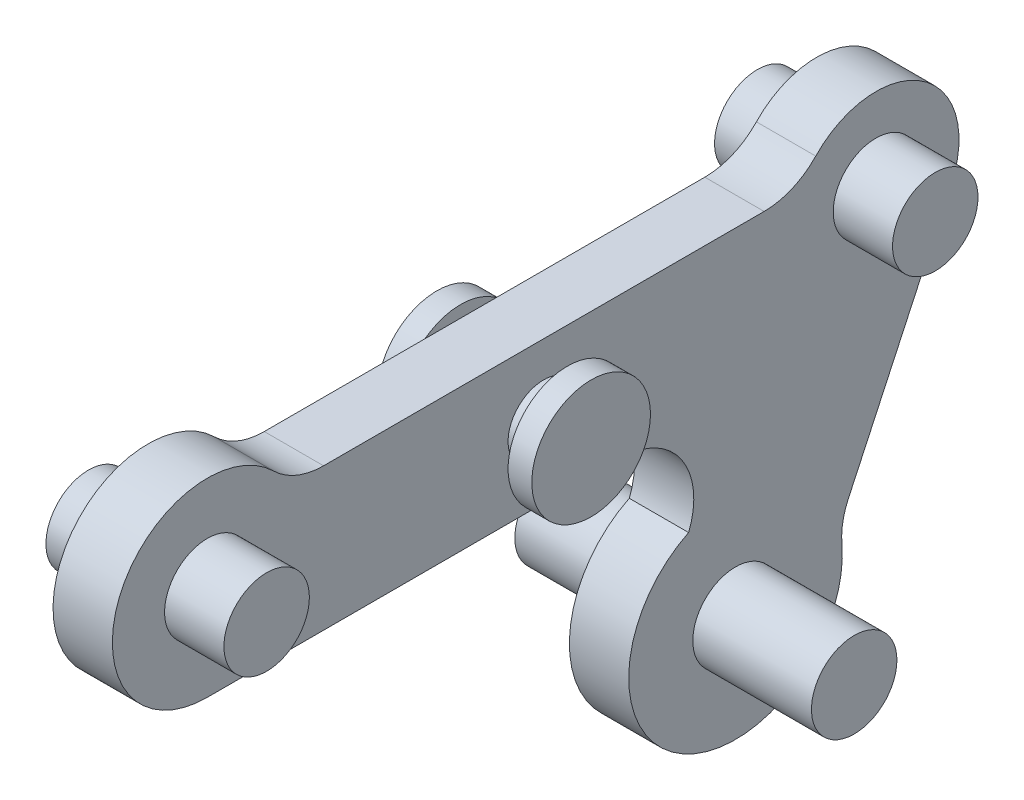
ISO-10303-21;
HEADER;
FILE_DESCRIPTION(('STEP AP214'),'2;1');
FILE_NAME('part.step','',(''),(''),'','','');
FILE_SCHEMA(('AUTOMOTIVE_DESIGN { 1 0 10303 214 1 1 1 1 }'));
ENDSEC;
DATA;
#1=APPLICATION_CONTEXT('core data for automotive mechanical design processes');
#2=APPLICATION_PROTOCOL_DEFINITION('international standard','automotive_design',2000,#1);
#3=PRODUCT_CONTEXT('',#1,'mechanical');
#4=PRODUCT('Part','Part','',(#3));
#5=PRODUCT_RELATED_PRODUCT_CATEGORY('part','',(#4));
#6=PRODUCT_DEFINITION_FORMATION('','',#4);
#7=PRODUCT_DEFINITION_CONTEXT('part definition',#1,'design');
#8=PRODUCT_DEFINITION('design','',#6,#7);
#9=PRODUCT_DEFINITION_SHAPE('','',#8);
#10=(LENGTH_UNIT() NAMED_UNIT(*) SI_UNIT(.MILLI.,.METRE.));
#11=(NAMED_UNIT(*) PLANE_ANGLE_UNIT() SI_UNIT($,.RADIAN.));
#12=(NAMED_UNIT(*) SI_UNIT($,.STERADIAN.) SOLID_ANGLE_UNIT());
#13=UNCERTAINTY_MEASURE_WITH_UNIT(LENGTH_MEASURE(1.E-05),#10,'distance_accuracy_value','');
#14=(GEOMETRIC_REPRESENTATION_CONTEXT(3) GLOBAL_UNCERTAINTY_ASSIGNED_CONTEXT((#13)) GLOBAL_UNIT_ASSIGNED_CONTEXT((#10,
#11,#12)) REPRESENTATION_CONTEXT('',''));
#15=CARTESIAN_POINT('',(0.,0.,0.));
#16=DIRECTION('',(0.,0.,1.));
#17=DIRECTION('',(1.,0.,0.));
#18=AXIS2_PLACEMENT_3D('',#15,#16,#17);
#19=CARTESIAN_POINT('',(1.25,-0.520836083907537,28.1720772546283));
#20=DIRECTION('',(1.,0.,0.));
#21=DIRECTION('',(0.,0.,-1.));
#22=AXIS2_PLACEMENT_3D('',#19,#20,#21);
#23=PLANE('',#22);
#24=CARTESIAN_POINT('',(1.25,-1.52083608390754,14.));
#25=DIRECTION('',(1.,0.,0.));
#26=DIRECTION('',(0.,0.,-1.));
#27=AXIS2_PLACEMENT_3D('',#24,#25,#26);
#28=CIRCLE('',#27,1.5);
#29=CARTESIAN_POINT('',(1.25,-1.52083608390754,12.5));
#30=VERTEX_POINT('',#29);
#31=EDGE_CURVE('E271',#30,#30,#28,.T.);
#32=ORIENTED_EDGE('',*,*,#31,.F.);
#33=EDGE_LOOP('',(#32));
#34=FACE_BOUND('',#33,.T.);
#35=CARTESIAN_POINT('',(1.25,-12.6883090185131,5.91665566436985));
#36=DIRECTION('',(1.,0.,0.));
#37=DIRECTION('',(0.,0.,-1.));
#38=AXIS2_PLACEMENT_3D('',#35,#36,#37);
#39=CIRCLE('',#38,1.8);
#40=CARTESIAN_POINT('',(1.25,-12.6883090185131,4.11665566436985));
#41=VERTEX_POINT('',#40);
#42=EDGE_CURVE('E279',#41,#41,#39,.T.);
#43=ORIENTED_EDGE('',*,*,#42,.F.);
#44=EDGE_LOOP('',(#43));
#45=FACE_BOUND('',#44,.T.);
#46=CARTESIAN_POINT('',(1.25,0.,0.));
#47=DIRECTION('',(1.,0.,0.));
#48=DIRECTION('',(0.,0.,-1.));
#49=AXIS2_PLACEMENT_3D('',#46,#47,#48);
#50=CIRCLE('',#49,1.8);
#51=CARTESIAN_POINT('',(1.25,0.,-1.8));
#52=VERTEX_POINT('',#51);
#53=EDGE_CURVE('E287',#52,#52,#50,.T.);
#54=ORIENTED_EDGE('',*,*,#53,.F.);
#55=EDGE_LOOP('',(#54));
#56=FACE_BOUND('',#55,.T.);
#57=CARTESIAN_POINT('',(1.25,-0.520836083907537,28.1720772546283));
#58=DIRECTION('',(1.,0.,0.));
#59=DIRECTION('',(0.,0.,-1.));
#60=AXIS2_PLACEMENT_3D('',#57,#58,#59);
#61=CIRCLE('',#60,1.8);
#62=CARTESIAN_POINT('',(1.25,-0.520836083907537,26.3720772546283));
#63=VERTEX_POINT('',#62);
#64=EDGE_CURVE('E295',#63,#63,#61,.T.);
#65=ORIENTED_EDGE('',*,*,#64,.F.);
#66=EDGE_LOOP('',(#65));
#67=FACE_BOUND('',#66,.T.);
#68=DIRECTION('',(0.,-0.906307787036648,0.422618261740703));
#69=VECTOR('',#68,1.);
#70=CARTESIAN_POINT('',(1.25,-1.47916391609246,-3.17207725462827));
#71=LINE('',#70,#69);
#72=CARTESIAN_POINT('',(1.25,-1.47916391609246,-3.17207725462827));
#73=VERTEX_POINT('',#72);
#74=CARTESIAN_POINT('',(1.25,-10.7763797085491,1.16328566891389));
#75=VERTEX_POINT('',#74);
#76=EDGE_CURVE('E322',#73,#75,#71,.T.);
#77=ORIENTED_EDGE('',*,*,#76,.F.);
#78=CARTESIAN_POINT('',(1.25,0.,0.));
#79=DIRECTION('',(1.,0.,0.));
#80=DIRECTION('',(0.,0.,-1.));
#81=AXIS2_PLACEMENT_3D('',#78,#79,#80);
#82=CIRCLE('',#81,3.5);
#83=CARTESIAN_POINT('',(1.25,2.41185749328056,2.53632478837124));
#84=VERTEX_POINT('',#83);
#85=EDGE_CURVE('E316',#73,#84,#82,.T.);
#86=ORIENTED_EDGE('',*,*,#85,.T.);
#87=CARTESIAN_POINT('',(1.25,4.47916391609246,4.71031746411802));
#88=DIRECTION('',(1.,0.,0.));
#89=DIRECTION('',(0.,0.,-1.));
#90=AXIS2_PLACEMENT_3D('',#87,#88,#89);
#91=CIRCLE('',#90,3.);
#92=CARTESIAN_POINT('',(1.25,1.47916391609246,4.71031746411802));
#93=VERTEX_POINT('',#92);
#94=EDGE_CURVE('E136',#84,#93,#91,.F.);
#95=ORIENTED_EDGE('',*,*,#94,.T.);
#96=DIRECTION('',(0.,0.,-1.));
#97=VECTOR('',#96,1.);
#98=CARTESIAN_POINT('',(1.25,1.47916391609246,28.1720772546283));
#99=LINE('',#98,#97);
#100=CARTESIAN_POINT('',(1.25,1.47916391609246,23.2730977690619));
#101=VERTEX_POINT('',#100);
#102=EDGE_CURVE('E308',#101,#93,#99,.T.);
#103=ORIENTED_EDGE('',*,*,#102,.F.);
#104=CARTESIAN_POINT('',(1.25,4.47916391609246,23.2730977690619));
#105=DIRECTION('',(1.,0.,0.));
#106=DIRECTION('',(0.,0.,-1.));
#107=AXIS2_PLACEMENT_3D('',#104,#105,#106);
#108=CIRCLE('',#107,3.);
#109=CARTESIAN_POINT('',(1.25,2.33630677323532,25.3726604057332));
#110=VERTEX_POINT('',#109);
#111=EDGE_CURVE('E12',#101,#110,#108,.F.);
#112=ORIENTED_EDGE('',*,*,#111,.T.);
#113=CARTESIAN_POINT('',(1.25,-0.520836083907537,28.1720772546283));
#114=DIRECTION('',(1.,0.,0.));
#115=DIRECTION('',(0.,0.,-1.));
#116=AXIS2_PLACEMENT_3D('',#113,#114,#115);
#117=CIRCLE('',#116,3.99999999999999);
#118=CARTESIAN_POINT('',(1.25,-4.52083608390754,28.1720772546283));
#119=VERTEX_POINT('',#118);
#120=EDGE_CURVE('E217',#110,#119,#117,.T.);
#121=ORIENTED_EDGE('',*,*,#120,.T.);
#122=DIRECTION('',(0.,0.,-1.));
#123=VECTOR('',#122,1.);
#124=CARTESIAN_POINT('',(1.25,-4.52083608390754,28.1720772546283));
#125=LINE('',#124,#123);
#126=CARTESIAN_POINT('',(1.25,-4.52083608390754,10.674509524397));
#127=VERTEX_POINT('',#126);
#128=EDGE_CURVE('E213',#119,#127,#125,.T.);
#129=ORIENTED_EDGE('',*,*,#128,.T.);
#130=CARTESIAN_POINT('',(1.25,-7.52083608390754,10.674509524397));
#131=DIRECTION('',(1.,0.,0.));
#132=DIRECTION('',(0.,0.,-1.));
#133=AXIS2_PLACEMENT_3D('',#130,#131,#132);
#134=CIRCLE('',#133,3.);
#135=CARTESIAN_POINT('',(1.25,-8.64571957419743,7.89338796407762));
#136=VERTEX_POINT('',#135);
#137=EDGE_CURVE('E352',#127,#136,#134,.F.);
#138=ORIENTED_EDGE('',*,*,#137,.T.);
#139=CARTESIAN_POINT('',(1.25,-12.6883090185131,5.91665566436985));
#140=DIRECTION('',(1.,0.,0.));
#141=DIRECTION('',(0.,0.,-1.));
#142=AXIS2_PLACEMENT_3D('',#139,#140,#141);
#143=CIRCLE('',#142,4.50000000000002);
#144=CARTESIAN_POINT('',(1.25,-12.3018643036679,1.4332796504303));
#145=VERTEX_POINT('',#144);
#146=EDGE_CURVE('E303',#136,#145,#143,.T.);
#147=ORIENTED_EDGE('',*,*,#146,.T.);
#148=CARTESIAN_POINT('',(1.25,-12.0442344937712,-1.55563769219605));
#149=DIRECTION('',(1.,0.,0.));
#150=DIRECTION('',(0.,0.,-1.));
#151=AXIS2_PLACEMENT_3D('',#148,#149,#150);
#152=CIRCLE('',#151,3.);
#153=EDGE_CURVE('E349',#145,#75,#152,.F.);
#154=ORIENTED_EDGE('',*,*,#153,.T.);
#155=EDGE_LOOP('',(#77,#86,#95,#103,#112,#121,#129,#138,#147,#154));
#156=FACE_BOUND('',#155,.T.);
#157=ADVANCED_FACE('F127',(#34,#45,#56,#67,#156),#23,.T.);
#158=CARTESIAN_POINT('',(1.25,-0.520836083907537,28.1720772546283));
#159=DIRECTION('',(-1.,0.,0.));
#160=DIRECTION('',(0.,0.,1.));
#161=AXIS2_PLACEMENT_3D('',#158,#159,#160);
#162=CYLINDRICAL_SURFACE('',#161,3.99999999999999);
#163=ORIENTED_EDGE('',*,*,#120,.F.);
#164=DIRECTION('',(-1.,0.,0.));
#165=VECTOR('',#164,1.);
#166=CARTESIAN_POINT('',(1.25,2.33630677323532,25.3726604057332));
#167=LINE('',#166,#165);
#168=CARTESIAN_POINT('',(-1.25,2.33630677323532,25.3726604057332));
#169=VERTEX_POINT('',#168);
#170=EDGE_CURVE('E223',#110,#169,#167,.T.);
#171=ORIENTED_EDGE('',*,*,#170,.T.);
#172=CARTESIAN_POINT('',(-1.25,-0.520836083907537,28.1720772546283));
#173=DIRECTION('',(1.,0.,0.));
#174=DIRECTION('',(0.,0.,-1.));
#175=AXIS2_PLACEMENT_3D('',#172,#173,#174);
#176=CIRCLE('',#175,3.99999999999999);
#177=CARTESIAN_POINT('',(-1.25,-4.52083608390754,28.1720772546283));
#178=VERTEX_POINT('',#177);
#179=EDGE_CURVE('E220',#169,#178,#176,.T.);
#180=ORIENTED_EDGE('',*,*,#179,.T.);
#181=DIRECTION('',(-1.,0.,0.));
#182=VECTOR('',#181,1.);
#183=CARTESIAN_POINT('',(1.25,-4.52083608390753,28.1720772546283));
#184=LINE('',#183,#182);
#185=EDGE_CURVE('E206',#119,#178,#184,.T.);
#186=ORIENTED_EDGE('',*,*,#185,.F.);
#187=EDGE_LOOP('',(#163,#171,#180,#186));
#188=FACE_BOUND('',#187,.T.);
#189=ADVANCED_FACE('F221',(#188),#162,.T.);
#190=CARTESIAN_POINT('',(1.25,-12.6883090185131,5.91665566436985));
#191=DIRECTION('',(-1.,0.,0.));
#192=DIRECTION('',(0.,0.,1.));
#193=AXIS2_PLACEMENT_3D('',#190,#191,#192);
#194=CYLINDRICAL_SURFACE('',#193,4.50000000000002);
#195=DIRECTION('',(-1.,0.,0.));
#196=VECTOR('',#195,1.);
#197=CARTESIAN_POINT('',(1.25,-8.64571957419743,7.89338796407762));
#198=LINE('',#197,#196);
#199=CARTESIAN_POINT('',(-1.25,-8.64571957419743,7.89338796407762));
#200=VERTEX_POINT('',#199);
#201=EDGE_CURVE('E319',#136,#200,#198,.T.);
#202=ORIENTED_EDGE('',*,*,#201,.T.);
#203=CARTESIAN_POINT('',(-1.25,-12.6883090185131,5.91665566436985));
#204=DIRECTION('',(1.,0.,0.));
#205=DIRECTION('',(0.,0.,-1.));
#206=AXIS2_PLACEMENT_3D('',#203,#204,#205);
#207=CIRCLE('',#206,4.50000000000002);
#208=CARTESIAN_POINT('',(-1.25,-12.3018643036679,1.4332796504303));
#209=VERTEX_POINT('',#208);
#210=EDGE_CURVE('E249',#200,#209,#207,.T.);
#211=ORIENTED_EDGE('',*,*,#210,.T.);
#212=DIRECTION('',(-1.,0.,0.));
#213=VECTOR('',#212,1.);
#214=CARTESIAN_POINT('',(1.25,-12.3018643036679,1.4332796504303));
#215=LINE('',#214,#213);
#216=EDGE_CURVE('E333',#209,#145,#215,.F.);
#217=ORIENTED_EDGE('',*,*,#216,.T.);
#218=ORIENTED_EDGE('',*,*,#146,.F.);
#219=EDGE_LOOP('',(#202,#211,#217,#218));
#220=FACE_BOUND('',#219,.T.);
#221=ADVANCED_FACE('F377',(#220),#194,.T.);
#222=CARTESIAN_POINT('',(1.25,-1.47916391609246,-3.17207725462827));
#223=DIRECTION('',(0.,-0.422618261740703,-0.906307787036648));
#224=DIRECTION('',(0.,0.906307787036648,-0.422618261740703));
#225=AXIS2_PLACEMENT_3D('',#222,#223,#224);
#226=PLANE('',#225);
#227=ORIENTED_EDGE('',*,*,#76,.T.);
#228=DIRECTION('',(-1.,0.,0.));
#229=VECTOR('',#228,1.);
#230=CARTESIAN_POINT('',(1.25,-10.7763797085491,1.16328566891389));
#231=LINE('',#230,#229);
#232=CARTESIAN_POINT('',(-1.25,-10.7763797085491,1.16328566891389));
#233=VERTEX_POINT('',#232);
#234=EDGE_CURVE('E216',#75,#233,#231,.T.);
#235=ORIENTED_EDGE('',*,*,#234,.T.);
#236=DIRECTION('',(0.,-0.906307787036648,0.422618261740703));
#237=VECTOR('',#236,1.);
#238=CARTESIAN_POINT('',(-1.25,-1.47916391609246,-3.17207725462827));
#239=LINE('',#238,#237);
#240=CARTESIAN_POINT('',(-1.25,-1.47916391609246,-3.17207725462827));
#241=VERTEX_POINT('',#240);
#242=EDGE_CURVE('E243',#241,#233,#239,.T.);
#243=ORIENTED_EDGE('',*,*,#242,.F.);
#244=DIRECTION('',(-1.,0.,0.));
#245=VECTOR('',#244,1.);
#246=CARTESIAN_POINT('',(1.25,-1.47916391609246,-3.17207725462827));
#247=LINE('',#246,#245);
#248=EDGE_CURVE('E312',#73,#241,#247,.T.);
#249=ORIENTED_EDGE('',*,*,#248,.F.);
#250=EDGE_LOOP('',(#227,#235,#243,#249));
#251=FACE_BOUND('',#250,.T.);
#252=ADVANCED_FACE('F383',(#251),#226,.T.);
#253=CARTESIAN_POINT('',(1.25,0.,0.));
#254=DIRECTION('',(-1.,0.,0.));
#255=DIRECTION('',(0.,0.,1.));
#256=AXIS2_PLACEMENT_3D('',#253,#254,#255);
#257=CYLINDRICAL_SURFACE('',#256,3.5);
#258=ORIENTED_EDGE('',*,*,#248,.T.);
#259=CARTESIAN_POINT('',(-1.25,0.,0.));
#260=DIRECTION('',(1.,0.,0.));
#261=DIRECTION('',(0.,0.,-1.));
#262=AXIS2_PLACEMENT_3D('',#259,#260,#261);
#263=CIRCLE('',#262,3.5);
#264=CARTESIAN_POINT('',(-1.25,2.41185749328056,2.53632478837124));
#265=VERTEX_POINT('',#264);
#266=EDGE_CURVE('E237',#241,#265,#263,.T.);
#267=ORIENTED_EDGE('',*,*,#266,.T.);
#268=DIRECTION('',(-1.,0.,0.));
#269=VECTOR('',#268,1.);
#270=CARTESIAN_POINT('',(1.25,2.41185749328056,2.53632478837124));
#271=LINE('',#270,#269);
#272=EDGE_CURVE('E149',#265,#84,#271,.F.);
#273=ORIENTED_EDGE('',*,*,#272,.T.);
#274=ORIENTED_EDGE('',*,*,#85,.F.);
#275=EDGE_LOOP('',(#258,#267,#273,#274));
#276=FACE_BOUND('',#275,.T.);
#277=ADVANCED_FACE('F389',(#276),#257,.T.);
#278=CARTESIAN_POINT('',(1.25,1.47916391609246,28.1720772546283));
#279=DIRECTION('',(0.,1.,0.));
#280=DIRECTION('',(0.,0.,1.));
#281=AXIS2_PLACEMENT_3D('',#278,#279,#280);
#282=PLANE('',#281);
#283=ORIENTED_EDGE('',*,*,#102,.T.);
#284=DIRECTION('',(-1.,0.,0.));
#285=VECTOR('',#284,1.);
#286=CARTESIAN_POINT('',(1.25,1.47916391609246,4.71031746411802));
#287=LINE('',#286,#285);
#288=CARTESIAN_POINT('',(-1.25,1.47916391609246,4.71031746411802));
#289=VERTEX_POINT('',#288);
#290=EDGE_CURVE('E342',#93,#289,#287,.T.);
#291=ORIENTED_EDGE('',*,*,#290,.T.);
#292=DIRECTION('',(0.,0.,-1.));
#293=VECTOR('',#292,1.);
#294=CARTESIAN_POINT('',(-1.25,1.47916391609246,28.1720772546283));
#295=LINE('',#294,#293);
#296=CARTESIAN_POINT('',(-1.25,1.47916391609246,23.2730977690619));
#297=VERTEX_POINT('',#296);
#298=EDGE_CURVE('E229',#297,#289,#295,.T.);
#299=ORIENTED_EDGE('',*,*,#298,.F.);
#300=DIRECTION('',(-1.,0.,0.));
#301=VECTOR('',#300,1.);
#302=CARTESIAN_POINT('',(1.25,1.47916391609246,23.2730977690619));
#303=LINE('',#302,#301);
#304=EDGE_CURVE('E339',#297,#101,#303,.F.);
#305=ORIENTED_EDGE('',*,*,#304,.T.);
#306=EDGE_LOOP('',(#283,#291,#299,#305));
#307=FACE_BOUND('',#306,.T.);
#308=ADVANCED_FACE('F360',(#307),#282,.T.);
#309=CARTESIAN_POINT('',(1.25,-4.52083608390754,28.1720772546283));
#310=DIRECTION('',(0.,1.,0.));
#311=DIRECTION('',(0.,0.,1.));
#312=AXIS2_PLACEMENT_3D('',#309,#310,#311);
#313=PLANE('',#312);
#314=ORIENTED_EDGE('',*,*,#185,.T.);
#315=DIRECTION('',(0.,0.,-1.));
#316=VECTOR('',#315,1.);
#317=CARTESIAN_POINT('',(-1.25,-4.52083608390754,28.1720772546283));
#318=LINE('',#317,#316);
#319=CARTESIAN_POINT('',(-1.25,-4.52083608390754,10.674509524397));
#320=VERTEX_POINT('',#319);
#321=EDGE_CURVE('E210',#178,#320,#318,.T.);
#322=ORIENTED_EDGE('',*,*,#321,.T.);
#323=DIRECTION('',(-1.,0.,0.));
#324=VECTOR('',#323,1.);
#325=CARTESIAN_POINT('',(1.25,-4.52083608390754,10.674509524397));
#326=LINE('',#325,#324);
#327=EDGE_CURVE('E336',#320,#127,#326,.F.);
#328=ORIENTED_EDGE('',*,*,#327,.T.);
#329=ORIENTED_EDGE('',*,*,#128,.F.);
#330=EDGE_LOOP('',(#314,#322,#328,#329));
#331=FACE_BOUND('',#330,.T.);
#332=ADVANCED_FACE('F208',(#331),#313,.F.);
#333=CARTESIAN_POINT('',(1.25,-12.0442344937712,-1.55563769219605));
#334=DIRECTION('',(-1.,0.,0.));
#335=DIRECTION('',(0.,0.,1.));
#336=AXIS2_PLACEMENT_3D('',#333,#334,#335);
#337=CYLINDRICAL_SURFACE('',#336,3.);
#338=ORIENTED_EDGE('',*,*,#153,.F.);
#339=ORIENTED_EDGE('',*,*,#216,.F.);
#340=CARTESIAN_POINT('',(-1.25,-12.0442344937712,-1.55563769219605));
#341=DIRECTION('',(1.,0.,0.));
#342=DIRECTION('',(0.,0.,-1.));
#343=AXIS2_PLACEMENT_3D('',#340,#341,#342);
#344=CIRCLE('',#343,3.);
#345=EDGE_CURVE('E228',#209,#233,#344,.F.);
#346=ORIENTED_EDGE('',*,*,#345,.T.);
#347=ORIENTED_EDGE('',*,*,#234,.F.);
#348=EDGE_LOOP('',(#338,#339,#346,#347));
#349=FACE_BOUND('',#348,.T.);
#350=ADVANCED_FACE('F388',(#349),#337,.F.);
#351=CARTESIAN_POINT('',(1.25,-7.52083608390754,10.674509524397));
#352=DIRECTION('',(-1.,0.,0.));
#353=DIRECTION('',(0.,0.,1.));
#354=AXIS2_PLACEMENT_3D('',#351,#352,#353);
#355=CYLINDRICAL_SURFACE('',#354,3.);
#356=ORIENTED_EDGE('',*,*,#137,.F.);
#357=ORIENTED_EDGE('',*,*,#327,.F.);
#358=CARTESIAN_POINT('',(-1.25,-7.52083608390754,10.674509524397));
#359=DIRECTION('',(1.,0.,0.));
#360=DIRECTION('',(0.,0.,-1.));
#361=AXIS2_PLACEMENT_3D('',#358,#359,#360);
#362=CIRCLE('',#361,3.);
#363=EDGE_CURVE('E235',#320,#200,#362,.F.);
#364=ORIENTED_EDGE('',*,*,#363,.T.);
#365=ORIENTED_EDGE('',*,*,#201,.F.);
#366=EDGE_LOOP('',(#356,#357,#364,#365));
#367=FACE_BOUND('',#366,.T.);
#368=ADVANCED_FACE('F375',(#367),#355,.F.);
#369=CARTESIAN_POINT('',(1.25,4.47916391609246,4.71031746411802));
#370=DIRECTION('',(-1.,0.,0.));
#371=DIRECTION('',(0.,0.,1.));
#372=AXIS2_PLACEMENT_3D('',#369,#370,#371);
#373=CYLINDRICAL_SURFACE('',#372,3.);
#374=ORIENTED_EDGE('',*,*,#94,.F.);
#375=ORIENTED_EDGE('',*,*,#272,.F.);
#376=CARTESIAN_POINT('',(-1.25,4.47916391609246,4.71031746411802));
#377=DIRECTION('',(1.,0.,0.));
#378=DIRECTION('',(0.,0.,-1.));
#379=AXIS2_PLACEMENT_3D('',#376,#377,#378);
#380=CIRCLE('',#379,3.);
#381=EDGE_CURVE('E259',#265,#289,#380,.F.);
#382=ORIENTED_EDGE('',*,*,#381,.T.);
#383=ORIENTED_EDGE('',*,*,#290,.F.);
#384=EDGE_LOOP('',(#374,#375,#382,#383));
#385=FACE_BOUND('',#384,.T.);
#386=ADVANCED_FACE('F362',(#385),#373,.F.);
#387=CARTESIAN_POINT('',(1.25,4.47916391609246,23.2730977690619));
#388=DIRECTION('',(-1.,0.,0.));
#389=DIRECTION('',(0.,0.,1.));
#390=AXIS2_PLACEMENT_3D('',#387,#388,#389);
#391=CYLINDRICAL_SURFACE('',#390,3.);
#392=ORIENTED_EDGE('',*,*,#111,.F.);
#393=ORIENTED_EDGE('',*,*,#304,.F.);
#394=CARTESIAN_POINT('',(-1.25,4.47916391609246,23.2730977690619));
#395=DIRECTION('',(1.,0.,0.));
#396=DIRECTION('',(0.,0.,-1.));
#397=AXIS2_PLACEMENT_3D('',#394,#395,#396);
#398=CIRCLE('',#397,3.);
#399=EDGE_CURVE('E263',#297,#169,#398,.F.);
#400=ORIENTED_EDGE('',*,*,#399,.T.);
#401=ORIENTED_EDGE('',*,*,#170,.F.);
#402=EDGE_LOOP('',(#392,#393,#400,#401));
#403=FACE_BOUND('',#402,.T.);
#404=ADVANCED_FACE('F129',(#403),#391,.F.);
#405=CARTESIAN_POINT('',(3.75,-0.520836083907537,28.1720772546283));
#406=DIRECTION('',(-1.,0.,0.));
#407=DIRECTION('',(0.,0.,1.));
#408=AXIS2_PLACEMENT_3D('',#405,#406,#407);
#409=CYLINDRICAL_SURFACE('',#408,1.8);
#410=CARTESIAN_POINT('',(3.75,-0.520836083907537,28.1720772546283));
#411=DIRECTION('',(1.,0.,0.));
#412=DIRECTION('',(0.,0.,-1.));
#413=AXIS2_PLACEMENT_3D('',#410,#411,#412);
#414=CIRCLE('',#413,1.8);
#415=CARTESIAN_POINT('',(3.75,-0.520836083907537,26.3720772546283));
#416=VERTEX_POINT('',#415);
#417=EDGE_CURVE('E299',#416,#416,#414,.T.);
#418=ORIENTED_EDGE('',*,*,#417,.F.);
#419=EDGE_LOOP('',(#418));
#420=FACE_BOUND('',#419,.T.);
#421=ORIENTED_EDGE('',*,*,#64,.T.);
#422=EDGE_LOOP('',(#421));
#423=FACE_BOUND('',#422,.T.);
#424=ADVANCED_FACE('F367',(#420,#423),#409,.T.);
#425=CARTESIAN_POINT('',(3.75,0.,0.));
#426=DIRECTION('',(1.,0.,0.));
#427=DIRECTION('',(0.,0.,-1.));
#428=AXIS2_PLACEMENT_3D('',#425,#426,#427);
#429=PLANE('',#428);
#430=ORIENTED_EDGE('',*,*,#417,.T.);
#431=EDGE_LOOP('',(#430));
#432=FACE_BOUND('',#431,.T.);
#433=ADVANCED_FACE('F372',(#432),#429,.T.);
#434=CARTESIAN_POINT('',(3.75,0.,0.));
#435=DIRECTION('',(-1.,0.,0.));
#436=DIRECTION('',(0.,0.,1.));
#437=AXIS2_PLACEMENT_3D('',#434,#435,#436);
#438=CYLINDRICAL_SURFACE('',#437,1.8);
#439=CARTESIAN_POINT('',(3.75,0.,0.));
#440=DIRECTION('',(1.,0.,0.));
#441=DIRECTION('',(0.,0.,-1.));
#442=AXIS2_PLACEMENT_3D('',#439,#440,#441);
#443=CIRCLE('',#442,1.8);
#444=CARTESIAN_POINT('',(3.75,0.,-1.8));
#445=VERTEX_POINT('',#444);
#446=EDGE_CURVE('E291',#445,#445,#443,.T.);
#447=ORIENTED_EDGE('',*,*,#446,.F.);
#448=EDGE_LOOP('',(#447));
#449=FACE_BOUND('',#448,.T.);
#450=ORIENTED_EDGE('',*,*,#53,.T.);
#451=EDGE_LOOP('',(#450));
#452=FACE_BOUND('',#451,.T.);
#453=ADVANCED_FACE('F573',(#449,#452),#438,.T.);
#454=CARTESIAN_POINT('',(3.75,0.,0.));
#455=DIRECTION('',(1.,0.,0.));
#456=DIRECTION('',(0.,0.,-1.));
#457=AXIS2_PLACEMENT_3D('',#454,#455,#456);
#458=PLANE('',#457);
#459=ORIENTED_EDGE('',*,*,#446,.T.);
#460=EDGE_LOOP('',(#459));
#461=FACE_BOUND('',#460,.T.);
#462=ADVANCED_FACE('F569',(#461),#458,.T.);
#463=CARTESIAN_POINT('',(6.25,-12.6883090185131,5.91665566436985));
#464=DIRECTION('',(-1.,0.,0.));
#465=DIRECTION('',(0.,0.,1.));
#466=AXIS2_PLACEMENT_3D('',#463,#464,#465);
#467=CYLINDRICAL_SURFACE('',#466,1.8);
#468=CARTESIAN_POINT('',(6.25,-12.6883090185131,5.91665566436985));
#469=DIRECTION('',(1.,0.,0.));
#470=DIRECTION('',(0.,0.,-1.));
#471=AXIS2_PLACEMENT_3D('',#468,#469,#470);
#472=CIRCLE('',#471,1.8);
#473=CARTESIAN_POINT('',(6.25,-12.6883090185131,4.11665566436985));
#474=VERTEX_POINT('',#473);
#475=EDGE_CURVE('E283',#474,#474,#472,.T.);
#476=ORIENTED_EDGE('',*,*,#475,.F.);
#477=EDGE_LOOP('',(#476));
#478=FACE_BOUND('',#477,.T.);
#479=ORIENTED_EDGE('',*,*,#42,.T.);
#480=EDGE_LOOP('',(#479));
#481=FACE_BOUND('',#480,.T.);
#482=ADVANCED_FACE('F565',(#478,#481),#467,.T.);
#483=CARTESIAN_POINT('',(6.25,0.,0.));
#484=DIRECTION('',(1.,0.,0.));
#485=DIRECTION('',(0.,0.,-1.));
#486=AXIS2_PLACEMENT_3D('',#483,#484,#485);
#487=PLANE('',#486);
#488=ORIENTED_EDGE('',*,*,#475,.T.);
#489=EDGE_LOOP('',(#488));
#490=FACE_BOUND('',#489,.T.);
#491=ADVANCED_FACE('F561',(#490),#487,.T.);
#492=CARTESIAN_POINT('',(2.25,-1.52083608390754,14.));
#493=DIRECTION('',(-1.,0.,0.));
#494=DIRECTION('',(0.,0.,1.));
#495=AXIS2_PLACEMENT_3D('',#492,#493,#494);
#496=CYLINDRICAL_SURFACE('',#495,1.5);
#497=CARTESIAN_POINT('',(2.25,-1.52083608390754,14.));
#498=DIRECTION('',(1.,0.,0.));
#499=DIRECTION('',(0.,0.,-1.));
#500=AXIS2_PLACEMENT_3D('',#497,#498,#499);
#501=CIRCLE('',#500,1.5);
#502=CARTESIAN_POINT('',(2.25,-1.52083608390754,12.5));
#503=VERTEX_POINT('',#502);
#504=EDGE_CURVE('E275',#503,#503,#501,.T.);
#505=ORIENTED_EDGE('',*,*,#504,.F.);
#506=EDGE_LOOP('',(#505));
#507=FACE_BOUND('',#506,.T.);
#508=ORIENTED_EDGE('',*,*,#31,.T.);
#509=EDGE_LOOP('',(#508));
#510=FACE_BOUND('',#509,.T.);
#511=ADVANCED_FACE('F557',(#507,#510),#496,.T.);
#512=CARTESIAN_POINT('',(3.25,-1.52083608390754,14.));
#513=DIRECTION('',(-1.,0.,0.));
#514=DIRECTION('',(0.,0.,1.));
#515=AXIS2_PLACEMENT_3D('',#512,#513,#514);
#516=CYLINDRICAL_SURFACE('',#515,2.5);
#517=CARTESIAN_POINT('',(3.25,-1.52083608390754,14.));
#518=DIRECTION('',(1.,0.,0.));
#519=DIRECTION('',(0.,0.,-1.));
#520=AXIS2_PLACEMENT_3D('',#517,#518,#519);
#521=CIRCLE('',#520,2.5);
#522=CARTESIAN_POINT('',(3.25,-1.52083608390754,11.5));
#523=VERTEX_POINT('',#522);
#524=EDGE_CURVE('E267',#523,#523,#521,.T.);
#525=ORIENTED_EDGE('',*,*,#524,.F.);
#526=EDGE_LOOP('',(#525));
#527=FACE_BOUND('',#526,.T.);
#528=CARTESIAN_POINT('',(2.25,-1.52083608390754,14.));
#529=DIRECTION('',(1.,0.,0.));
#530=DIRECTION('',(0.,0.,-1.));
#531=AXIS2_PLACEMENT_3D('',#528,#529,#530);
#532=CIRCLE('',#531,2.5);
#533=CARTESIAN_POINT('',(2.25,-1.52083608390754,11.5));
#534=VERTEX_POINT('',#533);
#535=EDGE_CURVE('E266',#534,#534,#532,.T.);
#536=ORIENTED_EDGE('',*,*,#535,.T.);
#537=EDGE_LOOP('',(#536));
#538=FACE_BOUND('',#537,.T.);
#539=ADVANCED_FACE('F551',(#527,#538),#516,.T.);
#540=CARTESIAN_POINT('',(3.25,-1.52083608390754,14.));
#541=DIRECTION('',(1.,0.,0.));
#542=DIRECTION('',(0.,0.,-1.));
#543=AXIS2_PLACEMENT_3D('',#540,#541,#542);
#544=PLANE('',#543);
#545=ORIENTED_EDGE('',*,*,#524,.T.);
#546=EDGE_LOOP('',(#545));
#547=FACE_BOUND('',#546,.T.);
#548=ADVANCED_FACE('F548',(#547),#544,.T.);
#549=CARTESIAN_POINT('',(2.25,-1.52083608390754,14.));
#550=DIRECTION('',(1.,0.,0.));
#551=DIRECTION('',(0.,0.,-1.));
#552=AXIS2_PLACEMENT_3D('',#549,#550,#551);
#553=PLANE('',#552);
#554=ORIENTED_EDGE('',*,*,#504,.T.);
#555=EDGE_LOOP('',(#554));
#556=FACE_BOUND('',#555,.T.);
#557=ORIENTED_EDGE('',*,*,#535,.F.);
#558=EDGE_LOOP('',(#557));
#559=FACE_BOUND('',#558,.T.);
#560=ADVANCED_FACE('F439',(#556,#559),#553,.F.);
#561=CARTESIAN_POINT('',(-1.25,-0.520836083907537,28.1720772546283));
#562=DIRECTION('',(-1.,0.,0.));
#563=DIRECTION('',(0.,0.,-1.));
#564=AXIS2_PLACEMENT_3D('',#561,#562,#563);
#565=PLANE('',#564);
#566=CARTESIAN_POINT('',(-1.25,-1.52083608390754,14.));
#567=DIRECTION('',(1.,0.,0.));
#568=DIRECTION('',(0.,0.,-1.));
#569=AXIS2_PLACEMENT_3D('',#566,#567,#568);
#570=CIRCLE('',#569,1.5);
#571=CARTESIAN_POINT('',(-1.25,-1.52083608390754,12.5));
#572=VERTEX_POINT('',#571);
#573=EDGE_CURVE('E751',#572,#572,#570,.T.);
#574=ORIENTED_EDGE('',*,*,#573,.T.);
#575=EDGE_LOOP('',(#574));
#576=FACE_BOUND('',#575,.T.);
#577=CARTESIAN_POINT('',(-1.25,-12.6883090185131,5.91665566436985));
#578=DIRECTION('',(1.,0.,0.));
#579=DIRECTION('',(0.,0.,-1.));
#580=AXIS2_PLACEMENT_3D('',#577,#578,#579);
#581=CIRCLE('',#580,1.8);
#582=CARTESIAN_POINT('',(-1.25,-12.6883090185131,4.11665566436985));
#583=VERTEX_POINT('',#582);
#584=EDGE_CURVE('E756',#583,#583,#581,.T.);
#585=ORIENTED_EDGE('',*,*,#584,.T.);
#586=EDGE_LOOP('',(#585));
#587=FACE_BOUND('',#586,.T.);
#588=CARTESIAN_POINT('',(-1.25,0.,0.));
#589=DIRECTION('',(1.,0.,0.));
#590=DIRECTION('',(0.,0.,-1.));
#591=AXIS2_PLACEMENT_3D('',#588,#589,#590);
#592=CIRCLE('',#591,1.8);
#593=CARTESIAN_POINT('',(-1.25,0.,-1.8));
#594=VERTEX_POINT('',#593);
#595=EDGE_CURVE('E764',#594,#594,#592,.T.);
#596=ORIENTED_EDGE('',*,*,#595,.T.);
#597=EDGE_LOOP('',(#596));
#598=FACE_BOUND('',#597,.T.);
#599=CARTESIAN_POINT('',(-1.25,-0.520836083907537,28.1720772546283));
#600=DIRECTION('',(1.,0.,0.));
#601=DIRECTION('',(0.,0.,-1.));
#602=AXIS2_PLACEMENT_3D('',#599,#600,#601);
#603=CIRCLE('',#602,1.8);
#604=CARTESIAN_POINT('',(-1.25,-0.520836083907537,26.3720772546283));
#605=VERTEX_POINT('',#604);
#606=EDGE_CURVE('E772',#605,#605,#603,.T.);
#607=ORIENTED_EDGE('',*,*,#606,.T.);
#608=EDGE_LOOP('',(#607));
#609=FACE_BOUND('',#608,.T.);
#610=ORIENTED_EDGE('',*,*,#242,.T.);
#611=ORIENTED_EDGE('',*,*,#345,.F.);
#612=ORIENTED_EDGE('',*,*,#210,.F.);
#613=ORIENTED_EDGE('',*,*,#363,.F.);
#614=ORIENTED_EDGE('',*,*,#321,.F.);
#615=ORIENTED_EDGE('',*,*,#179,.F.);
#616=ORIENTED_EDGE('',*,*,#399,.F.);
#617=ORIENTED_EDGE('',*,*,#298,.T.);
#618=ORIENTED_EDGE('',*,*,#381,.F.);
#619=ORIENTED_EDGE('',*,*,#266,.F.);
#620=EDGE_LOOP('',(#610,#611,#612,#613,#614,#615,#616,#617,#618,#619));
#621=FACE_BOUND('',#620,.T.);
#622=ADVANCED_FACE('F232',(#576,#587,#598,#609,#621),#565,.T.);
#623=CARTESIAN_POINT('',(-3.75,-0.520836083907537,28.1720772546283));
#624=DIRECTION('',(1.,0.,0.));
#625=DIRECTION('',(0.,0.,1.));
#626=AXIS2_PLACEMENT_3D('',#623,#624,#625);
#627=CYLINDRICAL_SURFACE('',#626,1.8);
#628=CARTESIAN_POINT('',(-3.75,-0.520836083907537,28.1720772546283));
#629=DIRECTION('',(1.,0.,0.));
#630=DIRECTION('',(0.,0.,-1.));
#631=AXIS2_PLACEMENT_3D('',#628,#629,#630);
#632=CIRCLE('',#631,1.8);
#633=CARTESIAN_POINT('',(-3.75,-0.520836083907537,26.3720772546283));
#634=VERTEX_POINT('',#633);
#635=EDGE_CURVE('E253',#634,#634,#632,.T.);
#636=ORIENTED_EDGE('',*,*,#635,.T.);
#637=EDGE_LOOP('',(#636));
#638=FACE_BOUND('',#637,.T.);
#639=ORIENTED_EDGE('',*,*,#606,.F.);
#640=EDGE_LOOP('',(#639));
#641=FACE_BOUND('',#640,.T.);
#642=ADVANCED_FACE('F438',(#638,#641),#627,.T.);
#643=CARTESIAN_POINT('',(-3.75,0.,0.));
#644=DIRECTION('',(-1.,0.,0.));
#645=DIRECTION('',(0.,0.,-1.));
#646=AXIS2_PLACEMENT_3D('',#643,#644,#645);
#647=PLANE('',#646);
#648=ORIENTED_EDGE('',*,*,#635,.F.);
#649=EDGE_LOOP('',(#648));
#650=FACE_BOUND('',#649,.T.);
#651=ADVANCED_FACE('F451',(#650),#647,.T.);
#652=CARTESIAN_POINT('',(-3.75,0.,0.));
#653=DIRECTION('',(1.,0.,0.));
#654=DIRECTION('',(0.,0.,1.));
#655=AXIS2_PLACEMENT_3D('',#652,#653,#654);
#656=CYLINDRICAL_SURFACE('',#655,1.8);
#657=CARTESIAN_POINT('',(-3.75,0.,0.));
#658=DIRECTION('',(1.,0.,0.));
#659=DIRECTION('',(0.,0.,-1.));
#660=AXIS2_PLACEMENT_3D('',#657,#658,#659);
#661=CIRCLE('',#660,1.8);
#662=CARTESIAN_POINT('',(-3.75,0.,-1.8));
#663=VERTEX_POINT('',#662);
#664=EDGE_CURVE('E768',#663,#663,#661,.T.);
#665=ORIENTED_EDGE('',*,*,#664,.T.);
#666=EDGE_LOOP('',(#665));
#667=FACE_BOUND('',#666,.T.);
#668=ORIENTED_EDGE('',*,*,#595,.F.);
#669=EDGE_LOOP('',(#668));
#670=FACE_BOUND('',#669,.T.);
#671=ADVANCED_FACE('F461',(#667,#670),#656,.T.);
#672=CARTESIAN_POINT('',(-3.75,0.,0.));
#673=DIRECTION('',(-1.,0.,0.));
#674=DIRECTION('',(0.,0.,-1.));
#675=AXIS2_PLACEMENT_3D('',#672,#673,#674);
#676=PLANE('',#675);
#677=ORIENTED_EDGE('',*,*,#664,.F.);
#678=EDGE_LOOP('',(#677));
#679=FACE_BOUND('',#678,.T.);
#680=ADVANCED_FACE('F471',(#679),#676,.T.);
#681=CARTESIAN_POINT('',(-6.25,-12.6883090185131,5.91665566436985));
#682=DIRECTION('',(1.,0.,0.));
#683=DIRECTION('',(0.,0.,1.));
#684=AXIS2_PLACEMENT_3D('',#681,#682,#683);
#685=CYLINDRICAL_SURFACE('',#684,1.8);
#686=CARTESIAN_POINT('',(-6.25,-12.6883090185131,5.91665566436985));
#687=DIRECTION('',(1.,0.,0.));
#688=DIRECTION('',(0.,0.,-1.));
#689=AXIS2_PLACEMENT_3D('',#686,#687,#688);
#690=CIRCLE('',#689,1.8);
#691=CARTESIAN_POINT('',(-6.25,-12.6883090185131,4.11665566436985));
#692=VERTEX_POINT('',#691);
#693=EDGE_CURVE('E760',#692,#692,#690,.T.);
#694=ORIENTED_EDGE('',*,*,#693,.T.);
#695=EDGE_LOOP('',(#694));
#696=FACE_BOUND('',#695,.T.);
#697=ORIENTED_EDGE('',*,*,#584,.F.);
#698=EDGE_LOOP('',(#697));
#699=FACE_BOUND('',#698,.T.);
#700=ADVANCED_FACE('F481',(#696,#699),#685,.T.);
#701=CARTESIAN_POINT('',(-6.25,0.,0.));
#702=DIRECTION('',(-1.,0.,0.));
#703=DIRECTION('',(0.,0.,-1.));
#704=AXIS2_PLACEMENT_3D('',#701,#702,#703);
#705=PLANE('',#704);
#706=ORIENTED_EDGE('',*,*,#693,.F.);
#707=EDGE_LOOP('',(#706));
#708=FACE_BOUND('',#707,.T.);
#709=ADVANCED_FACE('F491',(#708),#705,.T.);
#710=CARTESIAN_POINT('',(-2.25,-1.52083608390754,14.));
#711=DIRECTION('',(1.,0.,0.));
#712=DIRECTION('',(0.,0.,1.));
#713=AXIS2_PLACEMENT_3D('',#710,#711,#712);
#714=CYLINDRICAL_SURFACE('',#713,1.5);
#715=CARTESIAN_POINT('',(-2.25,-1.52083608390754,14.));
#716=DIRECTION('',(1.,0.,0.));
#717=DIRECTION('',(0.,0.,-1.));
#718=AXIS2_PLACEMENT_3D('',#715,#716,#717);
#719=CIRCLE('',#718,1.5);
#720=CARTESIAN_POINT('',(-2.25,-1.52083608390754,12.5));
#721=VERTEX_POINT('',#720);
#722=EDGE_CURVE('E741',#721,#721,#719,.T.);
#723=ORIENTED_EDGE('',*,*,#722,.T.);
#724=EDGE_LOOP('',(#723));
#725=FACE_BOUND('',#724,.T.);
#726=ORIENTED_EDGE('',*,*,#573,.F.);
#727=EDGE_LOOP('',(#726));
#728=FACE_BOUND('',#727,.T.);
#729=ADVANCED_FACE('F501',(#725,#728),#714,.T.);
#730=CARTESIAN_POINT('',(-3.25,-1.52083608390754,14.));
#731=DIRECTION('',(1.,0.,0.));
#732=DIRECTION('',(0.,0.,1.));
#733=AXIS2_PLACEMENT_3D('',#730,#731,#732);
#734=CYLINDRICAL_SURFACE('',#733,2.5);
#735=CARTESIAN_POINT('',(-3.25,-1.52083608390754,14.));
#736=DIRECTION('',(1.,0.,0.));
#737=DIRECTION('',(0.,0.,-1.));
#738=AXIS2_PLACEMENT_3D('',#735,#736,#737);
#739=CIRCLE('',#738,2.5);
#740=CARTESIAN_POINT('',(-3.25,-1.52083608390754,11.5));
#741=VERTEX_POINT('',#740);
#742=EDGE_CURVE('E747',#741,#741,#739,.T.);
#743=ORIENTED_EDGE('',*,*,#742,.T.);
#744=EDGE_LOOP('',(#743));
#745=FACE_BOUND('',#744,.T.);
#746=CARTESIAN_POINT('',(-2.25,-1.52083608390754,14.));
#747=DIRECTION('',(1.,0.,0.));
#748=DIRECTION('',(0.,0.,-1.));
#749=AXIS2_PLACEMENT_3D('',#746,#747,#748);
#750=CIRCLE('',#749,2.5);
#751=CARTESIAN_POINT('',(-2.25,-1.52083608390754,11.5));
#752=VERTEX_POINT('',#751);
#753=EDGE_CURVE('E744',#752,#752,#750,.T.);
#754=ORIENTED_EDGE('',*,*,#753,.F.);
#755=EDGE_LOOP('',(#754));
#756=FACE_BOUND('',#755,.T.);
#757=ADVANCED_FACE('F511',(#745,#756),#734,.T.);
#758=CARTESIAN_POINT('',(-3.25,-1.52083608390754,14.));
#759=DIRECTION('',(-1.,0.,0.));
#760=DIRECTION('',(0.,0.,-1.));
#761=AXIS2_PLACEMENT_3D('',#758,#759,#760);
#762=PLANE('',#761);
#763=ORIENTED_EDGE('',*,*,#742,.F.);
#764=EDGE_LOOP('',(#763));
#765=FACE_BOUND('',#764,.T.);
#766=ADVANCED_FACE('F521',(#765),#762,.T.);
#767=CARTESIAN_POINT('',(-2.25,-1.52083608390754,14.));
#768=DIRECTION('',(-1.,0.,0.));
#769=DIRECTION('',(0.,0.,-1.));
#770=AXIS2_PLACEMENT_3D('',#767,#768,#769);
#771=PLANE('',#770);
#772=ORIENTED_EDGE('',*,*,#722,.F.);
#773=EDGE_LOOP('',(#772));
#774=FACE_BOUND('',#773,.T.);
#775=ORIENTED_EDGE('',*,*,#753,.T.);
#776=EDGE_LOOP('',(#775));
#777=FACE_BOUND('',#776,.T.);
#778=ADVANCED_FACE('F531',(#774,#777),#771,.F.);
#779=CLOSED_SHELL('',(#157,#189,#221,#252,#277,#308,#332,#350,#368,#386,#404,#424,#433,#453,
#462,#482,#491,#511,#539,#548,#560,#622,#642,#651,#671,#680,#700,#709,#729,#757,#766,#778));
#780=MANIFOLD_SOLID_BREP('B2',#779);
#781=ADVANCED_BREP_SHAPE_REPRESENTATION('',(#18,#780),#14);
#782=SHAPE_DEFINITION_REPRESENTATION(#9,#781);
ENDSEC;
END-ISO-10303-21;
